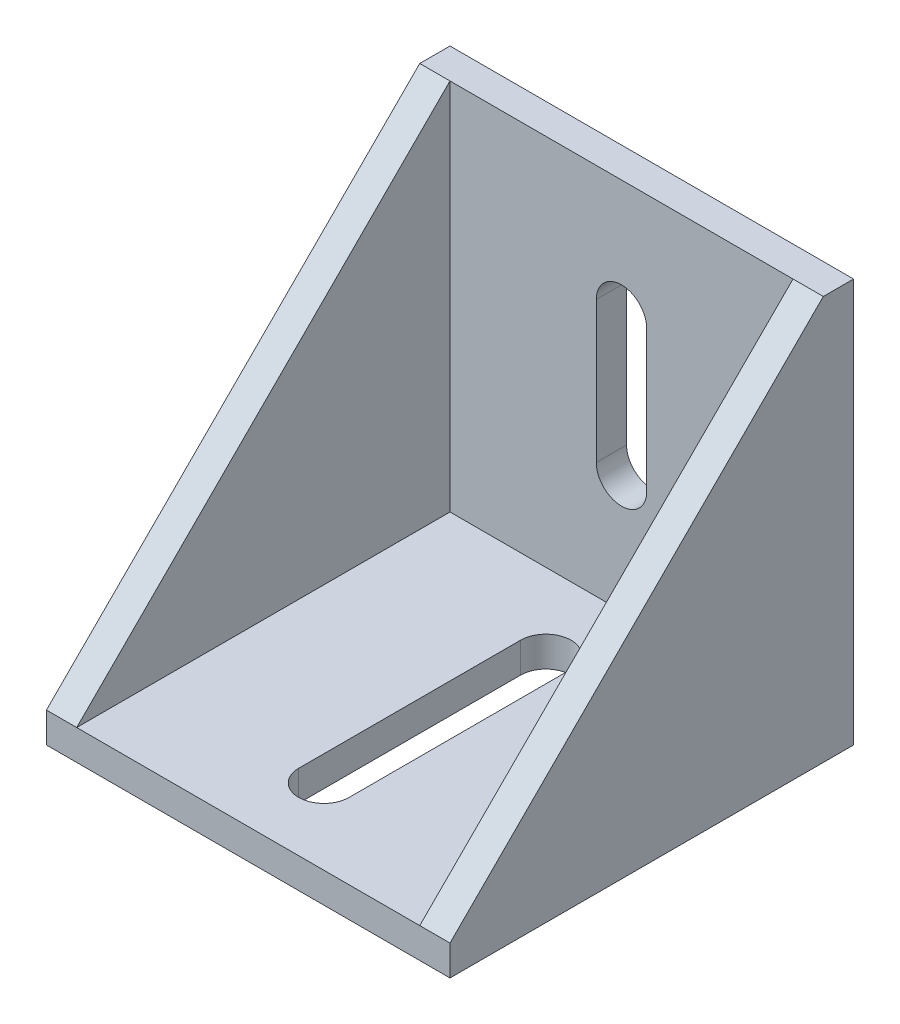
ISO-10303-21;
HEADER;
FILE_DESCRIPTION(('STEP AP214'),'2;1');
FILE_NAME('part.step','',(''),(''),'','','');
FILE_SCHEMA(('AUTOMOTIVE_DESIGN { 1 0 10303 214 1 1 1 1 }'));
ENDSEC;
DATA;
#1=APPLICATION_CONTEXT('core data for automotive mechanical design processes');
#2=APPLICATION_PROTOCOL_DEFINITION('international standard','automotive_design',2000,#1);
#3=PRODUCT_CONTEXT('',#1,'mechanical');
#4=PRODUCT('Part','Part','',(#3));
#5=PRODUCT_RELATED_PRODUCT_CATEGORY('part','',(#4));
#6=PRODUCT_DEFINITION_FORMATION('','',#4);
#7=PRODUCT_DEFINITION_CONTEXT('part definition',#1,'design');
#8=PRODUCT_DEFINITION('design','',#6,#7);
#9=PRODUCT_DEFINITION_SHAPE('','',#8);
#10=(LENGTH_UNIT() NAMED_UNIT(*) SI_UNIT(.MILLI.,.METRE.));
#11=(NAMED_UNIT(*) PLANE_ANGLE_UNIT() SI_UNIT($,.RADIAN.));
#12=(NAMED_UNIT(*) SI_UNIT($,.STERADIAN.) SOLID_ANGLE_UNIT());
#13=UNCERTAINTY_MEASURE_WITH_UNIT(LENGTH_MEASURE(1.E-05),#10,'distance_accuracy_value','');
#14=(GEOMETRIC_REPRESENTATION_CONTEXT(3) GLOBAL_UNCERTAINTY_ASSIGNED_CONTEXT((#13)) GLOBAL_UNIT_ASSIGNED_CONTEXT((#10,
#11,#12)) REPRESENTATION_CONTEXT('',''));
#15=CARTESIAN_POINT('',(0.,0.,0.));
#16=DIRECTION('',(0.,0.,1.));
#17=DIRECTION('',(1.,0.,0.));
#18=AXIS2_PLACEMENT_3D('',#15,#16,#17);
#19=CARTESIAN_POINT('',(0.,3.,40.));
#20=DIRECTION('',(1.,0.,0.));
#21=DIRECTION('',(0.,0.,-1.));
#22=AXIS2_PLACEMENT_3D('',#19,#20,#21);
#23=PLANE('',#22);
#24=DIRECTION('',(0.,-1.,0.));
#25=VECTOR('',#24,1.);
#26=CARTESIAN_POINT('',(0.,3.,40.));
#27=LINE('',#26,#25);
#28=CARTESIAN_POINT('',(0.,3.,40.));
#29=VERTEX_POINT('',#28);
#30=CARTESIAN_POINT('',(0.,0.,40.));
#31=VERTEX_POINT('',#30);
#32=EDGE_CURVE('E11',#29,#31,#27,.T.);
#33=ORIENTED_EDGE('',*,*,#32,.F.);
#34=DIRECTION('',(0.,0.707106781186548,-0.707106781186548));
#35=VECTOR('',#34,1.);
#36=CARTESIAN_POINT('',(0.,40.,3.));
#37=LINE('',#36,#35);
#38=CARTESIAN_POINT('',(0.,40.,3.));
#39=VERTEX_POINT('',#38);
#40=EDGE_CURVE('E229',#29,#39,#37,.T.);
#41=ORIENTED_EDGE('',*,*,#40,.T.);
#42=DIRECTION('',(0.,0.,-1.));
#43=VECTOR('',#42,1.);
#44=CARTESIAN_POINT('',(0.,40.,3.));
#45=LINE('',#44,#43);
#46=CARTESIAN_POINT('',(0.,40.,0.));
#47=VERTEX_POINT('',#46);
#48=EDGE_CURVE('E246',#39,#47,#45,.T.);
#49=ORIENTED_EDGE('',*,*,#48,.T.);
#50=DIRECTION('',(0.,-1.,0.));
#51=VECTOR('',#50,1.);
#52=CARTESIAN_POINT('',(0.,3.,0.));
#53=LINE('',#52,#51);
#54=CARTESIAN_POINT('',(0.,0.,0.));
#55=VERTEX_POINT('',#54);
#56=EDGE_CURVE('E258',#47,#55,#53,.T.);
#57=ORIENTED_EDGE('',*,*,#56,.T.);
#58=DIRECTION('',(0.,0.,1.));
#59=VECTOR('',#58,1.);
#60=CARTESIAN_POINT('',(0.,0.,40.));
#61=LINE('',#60,#59);
#62=EDGE_CURVE('E253',#55,#31,#61,.T.);
#63=ORIENTED_EDGE('',*,*,#62,.T.);
#64=EDGE_LOOP('',(#33,#41,#49,#57,#63));
#65=FACE_BOUND('',#64,.T.);
#66=ADVANCED_FACE('F33',(#65),#23,.F.);
#67=CARTESIAN_POINT('',(40.,3.,40.));
#68=DIRECTION('',(0.,0.,-1.));
#69=DIRECTION('',(-1.,0.,0.));
#70=AXIS2_PLACEMENT_3D('',#67,#68,#69);
#71=PLANE('',#70);
#72=DIRECTION('',(1.,0.,0.));
#73=VECTOR('',#72,1.);
#74=CARTESIAN_POINT('',(40.,0.,40.));
#75=LINE('',#74,#73);
#76=CARTESIAN_POINT('',(40.,0.,40.));
#77=VERTEX_POINT('',#76);
#78=EDGE_CURVE('E262',#31,#77,#75,.T.);
#79=ORIENTED_EDGE('',*,*,#78,.T.);
#80=DIRECTION('',(0.,-1.,0.));
#81=VECTOR('',#80,1.);
#82=CARTESIAN_POINT('',(40.,3.,40.));
#83=LINE('',#82,#81);
#84=CARTESIAN_POINT('',(40.,3.,40.));
#85=VERTEX_POINT('',#84);
#86=EDGE_CURVE('E42',#85,#77,#83,.T.);
#87=ORIENTED_EDGE('',*,*,#86,.F.);
#88=DIRECTION('',(1.,0.,0.));
#89=VECTOR('',#88,1.);
#90=CARTESIAN_POINT('',(37.,3.,40.));
#91=LINE('',#90,#89);
#92=CARTESIAN_POINT('',(37.,3.,40.));
#93=VERTEX_POINT('',#92);
#94=EDGE_CURVE('E227',#93,#85,#91,.T.);
#95=ORIENTED_EDGE('',*,*,#94,.F.);
#96=DIRECTION('',(1.,0.,0.));
#97=VECTOR('',#96,1.);
#98=CARTESIAN_POINT('',(40.,3.,40.));
#99=LINE('',#98,#97);
#100=CARTESIAN_POINT('',(3.,3.,40.));
#101=VERTEX_POINT('',#100);
#102=EDGE_CURVE('E259',#101,#93,#99,.T.);
#103=ORIENTED_EDGE('',*,*,#102,.F.);
#104=EDGE_CURVE('E256',#29,#101,#99,.T.);
#105=ORIENTED_EDGE('',*,*,#104,.F.);
#106=ORIENTED_EDGE('',*,*,#32,.T.);
#107=EDGE_LOOP('',(#79,#87,#95,#103,#105,#106));
#108=FACE_BOUND('',#107,.T.);
#109=ADVANCED_FACE('F315',(#108),#71,.F.);
#110=CARTESIAN_POINT('',(40.,3.,0.));
#111=DIRECTION('',(-1.,0.,0.));
#112=DIRECTION('',(0.,0.,1.));
#113=AXIS2_PLACEMENT_3D('',#110,#111,#112);
#114=PLANE('',#113);
#115=DIRECTION('',(0.,0.,-1.));
#116=VECTOR('',#115,1.);
#117=CARTESIAN_POINT('',(40.,0.,0.));
#118=LINE('',#117,#116);
#119=CARTESIAN_POINT('',(40.,0.,0.));
#120=VERTEX_POINT('',#119);
#121=EDGE_CURVE('E264',#77,#120,#118,.T.);
#122=ORIENTED_EDGE('',*,*,#121,.T.);
#123=DIRECTION('',(0.,-1.,0.));
#124=VECTOR('',#123,1.);
#125=CARTESIAN_POINT('',(40.,3.,0.));
#126=LINE('',#125,#124);
#127=CARTESIAN_POINT('',(40.,40.,0.));
#128=VERTEX_POINT('',#127);
#129=EDGE_CURVE('E270',#128,#120,#126,.T.);
#130=ORIENTED_EDGE('',*,*,#129,.F.);
#131=DIRECTION('',(0.,0.,-1.));
#132=VECTOR('',#131,1.);
#133=CARTESIAN_POINT('',(40.,40.,3.));
#134=LINE('',#133,#132);
#135=CARTESIAN_POINT('',(40.,40.,3.));
#136=VERTEX_POINT('',#135);
#137=EDGE_CURVE('E250',#136,#128,#134,.T.);
#138=ORIENTED_EDGE('',*,*,#137,.F.);
#139=DIRECTION('',(0.,-0.707106781186548,0.707106781186548));
#140=VECTOR('',#139,1.);
#141=CARTESIAN_POINT('',(40.,40.,3.));
#142=LINE('',#141,#140);
#143=EDGE_CURVE('E209',#136,#85,#142,.T.);
#144=ORIENTED_EDGE('',*,*,#143,.T.);
#145=ORIENTED_EDGE('',*,*,#86,.T.);
#146=EDGE_LOOP('',(#122,#130,#138,#144,#145));
#147=FACE_BOUND('',#146,.T.);
#148=ADVANCED_FACE('F277',(#147),#114,.F.);
#149=CARTESIAN_POINT('',(0.,3.,0.));
#150=DIRECTION('',(0.,0.,1.));
#151=DIRECTION('',(1.,0.,0.));
#152=AXIS2_PLACEMENT_3D('',#149,#150,#151);
#153=PLANE('',#152);
#154=DIRECTION('',(0.,-1.,0.));
#155=VECTOR('',#154,1.);
#156=CARTESIAN_POINT('',(17.5,14.5,0.));
#157=LINE('',#156,#155);
#158=CARTESIAN_POINT('',(17.5,28.5,0.));
#159=VERTEX_POINT('',#158);
#160=CARTESIAN_POINT('',(17.5,14.5,0.));
#161=VERTEX_POINT('',#160);
#162=EDGE_CURVE('E194',#159,#161,#157,.T.);
#163=ORIENTED_EDGE('',*,*,#162,.T.);
#164=CARTESIAN_POINT('',(20.,14.5,0.));
#165=DIRECTION('',(0.,0.,1.));
#166=DIRECTION('',(1.,0.,0.));
#167=AXIS2_PLACEMENT_3D('',#164,#165,#166);
#168=CIRCLE('',#167,2.5);
#169=CARTESIAN_POINT('',(22.5,14.5,0.));
#170=VERTEX_POINT('',#169);
#171=EDGE_CURVE('E184',#161,#170,#168,.T.);
#172=ORIENTED_EDGE('',*,*,#171,.T.);
#173=DIRECTION('',(0.,1.,0.));
#174=VECTOR('',#173,1.);
#175=CARTESIAN_POINT('',(22.5,14.5,0.));
#176=LINE('',#175,#174);
#177=CARTESIAN_POINT('',(22.5,28.5,0.));
#178=VERTEX_POINT('',#177);
#179=EDGE_CURVE('E187',#170,#178,#176,.T.);
#180=ORIENTED_EDGE('',*,*,#179,.T.);
#181=CARTESIAN_POINT('',(20.,28.5,0.));
#182=DIRECTION('',(0.,0.,1.));
#183=DIRECTION('',(1.,0.,0.));
#184=AXIS2_PLACEMENT_3D('',#181,#182,#183);
#185=CIRCLE('',#184,2.5);
#186=EDGE_CURVE('E191',#178,#159,#185,.T.);
#187=ORIENTED_EDGE('',*,*,#186,.T.);
#188=EDGE_LOOP('',(#163,#172,#180,#187));
#189=FACE_BOUND('',#188,.T.);
#190=DIRECTION('',(-1.,0.,0.));
#191=VECTOR('',#190,1.);
#192=CARTESIAN_POINT('',(0.,0.,0.));
#193=LINE('',#192,#191);
#194=EDGE_CURVE('E266',#120,#55,#193,.T.);
#195=ORIENTED_EDGE('',*,*,#194,.T.);
#196=ORIENTED_EDGE('',*,*,#56,.F.);
#197=DIRECTION('',(1.,0.,0.));
#198=VECTOR('',#197,1.);
#199=CARTESIAN_POINT('',(40.,40.,0.));
#200=LINE('',#199,#198);
#201=EDGE_CURVE('E240',#47,#128,#200,.T.);
#202=ORIENTED_EDGE('',*,*,#201,.T.);
#203=ORIENTED_EDGE('',*,*,#129,.T.);
#204=EDGE_LOOP('',(#195,#196,#202,#203));
#205=FACE_BOUND('',#204,.T.);
#206=ADVANCED_FACE('F284',(#189,#205),#153,.F.);
#207=CARTESIAN_POINT('',(0.,3.,0.));
#208=DIRECTION('',(0.,-1.,0.));
#209=DIRECTION('',(0.,0.,-1.));
#210=AXIS2_PLACEMENT_3D('',#207,#208,#209);
#211=PLANE('',#210);
#212=DIRECTION('',(0.,0.,-1.));
#213=VECTOR('',#212,1.);
#214=CARTESIAN_POINT('',(22.5,3.,32.5));
#215=LINE('',#214,#213);
#216=CARTESIAN_POINT('',(22.5,3.,32.5));
#217=VERTEX_POINT('',#216);
#218=CARTESIAN_POINT('',(22.5,3.,10.5));
#219=VERTEX_POINT('',#218);
#220=EDGE_CURVE('E174',#217,#219,#215,.T.);
#221=ORIENTED_EDGE('',*,*,#220,.F.);
#222=CARTESIAN_POINT('',(20.,3.,32.5));
#223=DIRECTION('',(0.,1.,0.));
#224=DIRECTION('',(0.,0.,1.));
#225=AXIS2_PLACEMENT_3D('',#222,#223,#224);
#226=CIRCLE('',#225,2.50000000000001);
#227=CARTESIAN_POINT('',(17.5,3.,32.5));
#228=VERTEX_POINT('',#227);
#229=EDGE_CURVE('E49',#228,#217,#226,.T.);
#230=ORIENTED_EDGE('',*,*,#229,.F.);
#231=DIRECTION('',(0.,0.,1.));
#232=VECTOR('',#231,1.);
#233=CARTESIAN_POINT('',(17.5,3.,32.5));
#234=LINE('',#233,#232);
#235=CARTESIAN_POINT('',(17.5,3.,10.5));
#236=VERTEX_POINT('',#235);
#237=EDGE_CURVE('E165',#236,#228,#234,.T.);
#238=ORIENTED_EDGE('',*,*,#237,.F.);
#239=CARTESIAN_POINT('',(20.,3.,10.5));
#240=DIRECTION('',(0.,1.,0.));
#241=DIRECTION('',(0.,0.,1.));
#242=AXIS2_PLACEMENT_3D('',#239,#240,#241);
#243=CIRCLE('',#242,2.50000000000001);
#244=EDGE_CURVE('E168',#219,#236,#243,.T.);
#245=ORIENTED_EDGE('',*,*,#244,.F.);
#246=EDGE_LOOP('',(#221,#230,#238,#245));
#247=FACE_BOUND('',#246,.T.);
#248=ORIENTED_EDGE('',*,*,#102,.T.);
#249=DIRECTION('',(0.,0.,-1.));
#250=VECTOR('',#249,1.);
#251=CARTESIAN_POINT('',(37.,3.,40.));
#252=LINE('',#251,#250);
#253=CARTESIAN_POINT('',(37.,3.,2.99999999999999));
#254=VERTEX_POINT('',#253);
#255=EDGE_CURVE('E221',#93,#254,#252,.T.);
#256=ORIENTED_EDGE('',*,*,#255,.T.);
#257=DIRECTION('',(-1.,0.,0.));
#258=VECTOR('',#257,1.);
#259=CARTESIAN_POINT('',(0.,3.,3.));
#260=LINE('',#259,#258);
#261=CARTESIAN_POINT('',(3.,3.,3.));
#262=VERTEX_POINT('',#261);
#263=EDGE_CURVE('E36',#254,#262,#260,.T.);
#264=ORIENTED_EDGE('',*,*,#263,.T.);
#265=DIRECTION('',(0.,0.,1.));
#266=VECTOR('',#265,1.);
#267=CARTESIAN_POINT('',(3.,3.,3.));
#268=LINE('',#267,#266);
#269=EDGE_CURVE('E232',#262,#101,#268,.T.);
#270=ORIENTED_EDGE('',*,*,#269,.T.);
#271=EDGE_LOOP('',(#248,#256,#264,#270));
#272=FACE_BOUND('',#271,.T.);
#273=ADVANCED_FACE('F307',(#247,#272),#211,.F.);
#274=CARTESIAN_POINT('',(0.,0.,0.));
#275=DIRECTION('',(0.,-1.,0.));
#276=DIRECTION('',(0.,0.,-1.));
#277=AXIS2_PLACEMENT_3D('',#274,#275,#276);
#278=PLANE('',#277);
#279=CARTESIAN_POINT('',(20.,0.,32.5));
#280=DIRECTION('',(0.,1.,0.));
#281=DIRECTION('',(0.,0.,1.));
#282=AXIS2_PLACEMENT_3D('',#279,#280,#281);
#283=CIRCLE('',#282,2.50000000000001);
#284=CARTESIAN_POINT('',(17.5,0.,32.5));
#285=VERTEX_POINT('',#284);
#286=CARTESIAN_POINT('',(22.5,0.,32.5));
#287=VERTEX_POINT('',#286);
#288=EDGE_CURVE('E149',#285,#287,#283,.T.);
#289=ORIENTED_EDGE('',*,*,#288,.T.);
#290=DIRECTION('',(0.,0.,-1.));
#291=VECTOR('',#290,1.);
#292=CARTESIAN_POINT('',(22.5,0.,32.5));
#293=LINE('',#292,#291);
#294=CARTESIAN_POINT('',(22.5,0.,10.5));
#295=VERTEX_POINT('',#294);
#296=EDGE_CURVE('E158',#287,#295,#293,.T.);
#297=ORIENTED_EDGE('',*,*,#296,.T.);
#298=CARTESIAN_POINT('',(20.,0.,10.5));
#299=DIRECTION('',(0.,1.,0.));
#300=DIRECTION('',(0.,0.,1.));
#301=AXIS2_PLACEMENT_3D('',#298,#299,#300);
#302=CIRCLE('',#301,2.50000000000001);
#303=CARTESIAN_POINT('',(17.5,0.,10.5));
#304=VERTEX_POINT('',#303);
#305=EDGE_CURVE('E57',#295,#304,#302,.T.);
#306=ORIENTED_EDGE('',*,*,#305,.T.);
#307=DIRECTION('',(0.,0.,1.));
#308=VECTOR('',#307,1.);
#309=CARTESIAN_POINT('',(17.5,0.,32.5));
#310=LINE('',#309,#308);
#311=EDGE_CURVE('E155',#304,#285,#310,.T.);
#312=ORIENTED_EDGE('',*,*,#311,.T.);
#313=EDGE_LOOP('',(#289,#297,#306,#312));
#314=FACE_BOUND('',#313,.T.);
#315=ORIENTED_EDGE('',*,*,#62,.F.);
#316=ORIENTED_EDGE('',*,*,#194,.F.);
#317=ORIENTED_EDGE('',*,*,#121,.F.);
#318=ORIENTED_EDGE('',*,*,#78,.F.);
#319=EDGE_LOOP('',(#315,#316,#317,#318));
#320=FACE_BOUND('',#319,.T.);
#321=ADVANCED_FACE('F162',(#314,#320),#278,.T.);
#322=CARTESIAN_POINT('',(40.,40.,3.));
#323=DIRECTION('',(0.,1.,0.));
#324=DIRECTION('',(0.,0.,1.));
#325=AXIS2_PLACEMENT_3D('',#322,#323,#324);
#326=PLANE('',#325);
#327=ORIENTED_EDGE('',*,*,#201,.F.);
#328=ORIENTED_EDGE('',*,*,#48,.F.);
#329=DIRECTION('',(1.,0.,0.));
#330=VECTOR('',#329,1.);
#331=CARTESIAN_POINT('',(40.,40.,3.));
#332=LINE('',#331,#330);
#333=CARTESIAN_POINT('',(3.,40.,3.));
#334=VERTEX_POINT('',#333);
#335=EDGE_CURVE('E243',#39,#334,#332,.T.);
#336=ORIENTED_EDGE('',*,*,#335,.T.);
#337=CARTESIAN_POINT('',(37.,40.,3.));
#338=VERTEX_POINT('',#337);
#339=EDGE_CURVE('E247',#334,#338,#332,.T.);
#340=ORIENTED_EDGE('',*,*,#339,.T.);
#341=DIRECTION('',(1.,0.,0.));
#342=VECTOR('',#341,1.);
#343=CARTESIAN_POINT('',(37.,40.,3.));
#344=LINE('',#343,#342);
#345=EDGE_CURVE('E224',#338,#136,#344,.T.);
#346=ORIENTED_EDGE('',*,*,#345,.T.);
#347=ORIENTED_EDGE('',*,*,#137,.T.);
#348=EDGE_LOOP('',(#327,#328,#336,#340,#346,#347));
#349=FACE_BOUND('',#348,.T.);
#350=ADVANCED_FACE('F291',(#349),#326,.T.);
#351=CARTESIAN_POINT('',(0.,0.,3.));
#352=DIRECTION('',(0.,0.,1.));
#353=DIRECTION('',(1.,0.,0.));
#354=AXIS2_PLACEMENT_3D('',#351,#352,#353);
#355=PLANE('',#354);
#356=CARTESIAN_POINT('',(20.,14.5,3.));
#357=DIRECTION('',(0.,0.,1.));
#358=DIRECTION('',(1.,0.,0.));
#359=AXIS2_PLACEMENT_3D('',#356,#357,#358);
#360=CIRCLE('',#359,2.5);
#361=CARTESIAN_POINT('',(17.5,14.5,3.));
#362=VERTEX_POINT('',#361);
#363=CARTESIAN_POINT('',(22.5,14.5,3.));
#364=VERTEX_POINT('',#363);
#365=EDGE_CURVE('E180',#362,#364,#360,.T.);
#366=ORIENTED_EDGE('',*,*,#365,.F.);
#367=DIRECTION('',(0.,-1.,0.));
#368=VECTOR('',#367,1.);
#369=CARTESIAN_POINT('',(17.5,14.5,3.));
#370=LINE('',#369,#368);
#371=CARTESIAN_POINT('',(17.5,28.5,3.));
#372=VERTEX_POINT('',#371);
#373=EDGE_CURVE('E188',#372,#362,#370,.T.);
#374=ORIENTED_EDGE('',*,*,#373,.F.);
#375=CARTESIAN_POINT('',(20.,28.5,3.));
#376=DIRECTION('',(0.,0.,1.));
#377=DIRECTION('',(1.,0.,0.));
#378=AXIS2_PLACEMENT_3D('',#375,#376,#377);
#379=CIRCLE('',#378,2.5);
#380=CARTESIAN_POINT('',(22.5,28.5,3.));
#381=VERTEX_POINT('',#380);
#382=EDGE_CURVE('E202',#381,#372,#379,.T.);
#383=ORIENTED_EDGE('',*,*,#382,.F.);
#384=DIRECTION('',(0.,1.,0.));
#385=VECTOR('',#384,1.);
#386=CARTESIAN_POINT('',(22.5,14.5,3.));
#387=LINE('',#386,#385);
#388=EDGE_CURVE('E199',#364,#381,#387,.T.);
#389=ORIENTED_EDGE('',*,*,#388,.F.);
#390=EDGE_LOOP('',(#366,#374,#383,#389));
#391=FACE_BOUND('',#390,.T.);
#392=DIRECTION('',(0.,1.,0.));
#393=VECTOR('',#392,1.);
#394=CARTESIAN_POINT('',(37.,3.,2.99999999999999));
#395=LINE('',#394,#393);
#396=EDGE_CURVE('E216',#254,#338,#395,.T.);
#397=ORIENTED_EDGE('',*,*,#396,.T.);
#398=ORIENTED_EDGE('',*,*,#339,.F.);
#399=DIRECTION('',(0.,-1.,0.));
#400=VECTOR('',#399,1.);
#401=CARTESIAN_POINT('',(3.,40.,3.));
#402=LINE('',#401,#400);
#403=EDGE_CURVE('E237',#334,#262,#402,.T.);
#404=ORIENTED_EDGE('',*,*,#403,.T.);
#405=ORIENTED_EDGE('',*,*,#263,.F.);
#406=EDGE_LOOP('',(#397,#398,#404,#405));
#407=FACE_BOUND('',#406,.T.);
#408=ADVANCED_FACE('F302',(#391,#407),#355,.T.);
#409=CARTESIAN_POINT('',(3.,40.,3.));
#410=DIRECTION('',(0.,0.707106781186547,0.707106781186547));
#411=DIRECTION('',(0.,-0.707106781186548,0.707106781186548));
#412=AXIS2_PLACEMENT_3D('',#409,#410,#411);
#413=PLANE('',#412);
#414=ORIENTED_EDGE('',*,*,#40,.F.);
#415=ORIENTED_EDGE('',*,*,#104,.T.);
#416=DIRECTION('',(0.,0.707106781186548,-0.707106781186548));
#417=VECTOR('',#416,1.);
#418=CARTESIAN_POINT('',(3.,40.,3.));
#419=LINE('',#418,#417);
#420=EDGE_CURVE('E235',#101,#334,#419,.T.);
#421=ORIENTED_EDGE('',*,*,#420,.T.);
#422=ORIENTED_EDGE('',*,*,#335,.F.);
#423=EDGE_LOOP('',(#414,#415,#421,#422));
#424=FACE_BOUND('',#423,.T.);
#425=ADVANCED_FACE('F313',(#424),#413,.T.);
#426=CARTESIAN_POINT('',(3.,0.,0.));
#427=DIRECTION('',(1.,0.,0.));
#428=DIRECTION('',(0.,0.,-1.));
#429=AXIS2_PLACEMENT_3D('',#426,#427,#428);
#430=PLANE('',#429);
#431=ORIENTED_EDGE('',*,*,#269,.F.);
#432=ORIENTED_EDGE('',*,*,#403,.F.);
#433=ORIENTED_EDGE('',*,*,#420,.F.);
#434=EDGE_LOOP('',(#431,#432,#433));
#435=FACE_BOUND('',#434,.T.);
#436=ADVANCED_FACE('F311',(#435),#430,.T.);
#437=CARTESIAN_POINT('',(37.,40.,3.));
#438=DIRECTION('',(0.,0.707106781186547,0.707106781186547));
#439=DIRECTION('',(0.,-0.707106781186548,0.707106781186548));
#440=AXIS2_PLACEMENT_3D('',#437,#438,#439);
#441=PLANE('',#440);
#442=ORIENTED_EDGE('',*,*,#143,.F.);
#443=ORIENTED_EDGE('',*,*,#345,.F.);
#444=DIRECTION('',(0.,-0.707106781186548,0.707106781186548));
#445=VECTOR('',#444,1.);
#446=CARTESIAN_POINT('',(37.,40.,3.));
#447=LINE('',#446,#445);
#448=EDGE_CURVE('E219',#338,#93,#447,.T.);
#449=ORIENTED_EDGE('',*,*,#448,.T.);
#450=ORIENTED_EDGE('',*,*,#94,.T.);
#451=EDGE_LOOP('',(#442,#443,#449,#450));
#452=FACE_BOUND('',#451,.T.);
#453=ADVANCED_FACE('F296',(#452),#441,.T.);
#454=CARTESIAN_POINT('',(37.,0.,0.));
#455=DIRECTION('',(-1.,0.,0.));
#456=DIRECTION('',(0.,0.,1.));
#457=AXIS2_PLACEMENT_3D('',#454,#455,#456);
#458=PLANE('',#457);
#459=ORIENTED_EDGE('',*,*,#396,.F.);
#460=ORIENTED_EDGE('',*,*,#255,.F.);
#461=ORIENTED_EDGE('',*,*,#448,.F.);
#462=EDGE_LOOP('',(#459,#460,#461));
#463=FACE_BOUND('',#462,.T.);
#464=ADVANCED_FACE('F299',(#463),#458,.T.);
#465=CARTESIAN_POINT('',(20.,14.5,0.));
#466=DIRECTION('',(0.,0.,1.));
#467=DIRECTION('',(1.,0.,0.));
#468=AXIS2_PLACEMENT_3D('',#465,#466,#467);
#469=CYLINDRICAL_SURFACE('',#468,2.5);
#470=ORIENTED_EDGE('',*,*,#365,.T.);
#471=DIRECTION('',(0.,0.,1.));
#472=VECTOR('',#471,1.);
#473=CARTESIAN_POINT('',(22.5,14.5,0.));
#474=LINE('',#473,#472);
#475=EDGE_CURVE('E197',#170,#364,#474,.T.);
#476=ORIENTED_EDGE('',*,*,#475,.F.);
#477=ORIENTED_EDGE('',*,*,#171,.F.);
#478=DIRECTION('',(0.,0.,1.));
#479=VECTOR('',#478,1.);
#480=CARTESIAN_POINT('',(17.5,14.5,0.));
#481=LINE('',#480,#479);
#482=EDGE_CURVE('E207',#161,#362,#481,.T.);
#483=ORIENTED_EDGE('',*,*,#482,.T.);
#484=EDGE_LOOP('',(#470,#476,#477,#483));
#485=FACE_BOUND('',#484,.T.);
#486=ADVANCED_FACE('F344',(#485),#469,.F.);
#487=CARTESIAN_POINT('',(17.5,14.5,0.));
#488=DIRECTION('',(-1.,0.,0.));
#489=DIRECTION('',(0.,-1.,0.));
#490=AXIS2_PLACEMENT_3D('',#487,#488,#489);
#491=PLANE('',#490);
#492=ORIENTED_EDGE('',*,*,#373,.T.);
#493=ORIENTED_EDGE('',*,*,#482,.F.);
#494=ORIENTED_EDGE('',*,*,#162,.F.);
#495=DIRECTION('',(0.,0.,1.));
#496=VECTOR('',#495,1.);
#497=CARTESIAN_POINT('',(17.5,28.5,0.));
#498=LINE('',#497,#496);
#499=EDGE_CURVE('E210',#159,#372,#498,.T.);
#500=ORIENTED_EDGE('',*,*,#499,.T.);
#501=EDGE_LOOP('',(#492,#493,#494,#500));
#502=FACE_BOUND('',#501,.T.);
#503=ADVANCED_FACE('F347',(#502),#491,.F.);
#504=CARTESIAN_POINT('',(20.,28.5,0.));
#505=DIRECTION('',(0.,0.,1.));
#506=DIRECTION('',(1.,0.,0.));
#507=AXIS2_PLACEMENT_3D('',#504,#505,#506);
#508=CYLINDRICAL_SURFACE('',#507,2.5);
#509=ORIENTED_EDGE('',*,*,#382,.T.);
#510=ORIENTED_EDGE('',*,*,#499,.F.);
#511=ORIENTED_EDGE('',*,*,#186,.F.);
#512=DIRECTION('',(0.,0.,1.));
#513=VECTOR('',#512,1.);
#514=CARTESIAN_POINT('',(22.5,28.5,0.));
#515=LINE('',#514,#513);
#516=EDGE_CURVE('E212',#178,#381,#515,.T.);
#517=ORIENTED_EDGE('',*,*,#516,.T.);
#518=EDGE_LOOP('',(#509,#510,#511,#517));
#519=FACE_BOUND('',#518,.T.);
#520=ADVANCED_FACE('F352',(#519),#508,.F.);
#521=CARTESIAN_POINT('',(22.5,14.5,0.));
#522=DIRECTION('',(1.,0.,0.));
#523=DIRECTION('',(0.,1.,0.));
#524=AXIS2_PLACEMENT_3D('',#521,#522,#523);
#525=PLANE('',#524);
#526=ORIENTED_EDGE('',*,*,#388,.T.);
#527=ORIENTED_EDGE('',*,*,#516,.F.);
#528=ORIENTED_EDGE('',*,*,#179,.F.);
#529=ORIENTED_EDGE('',*,*,#475,.T.);
#530=EDGE_LOOP('',(#526,#527,#528,#529));
#531=FACE_BOUND('',#530,.T.);
#532=ADVANCED_FACE('F349',(#531),#525,.F.);
#533=CARTESIAN_POINT('',(20.,0.,32.5));
#534=DIRECTION('',(0.,1.,0.));
#535=DIRECTION('',(0.,0.,1.));
#536=AXIS2_PLACEMENT_3D('',#533,#534,#535);
#537=CYLINDRICAL_SURFACE('',#536,2.50000000000001);
#538=ORIENTED_EDGE('',*,*,#229,.T.);
#539=DIRECTION('',(0.,1.,0.));
#540=VECTOR('',#539,1.);
#541=CARTESIAN_POINT('',(22.5,0.,32.5));
#542=LINE('',#541,#540);
#543=EDGE_CURVE('E145',#287,#217,#542,.T.);
#544=ORIENTED_EDGE('',*,*,#543,.F.);
#545=ORIENTED_EDGE('',*,*,#288,.F.);
#546=DIRECTION('',(0.,1.,0.));
#547=VECTOR('',#546,1.);
#548=CARTESIAN_POINT('',(17.5,0.,32.5));
#549=LINE('',#548,#547);
#550=EDGE_CURVE('E178',#285,#228,#549,.T.);
#551=ORIENTED_EDGE('',*,*,#550,.T.);
#552=EDGE_LOOP('',(#538,#544,#545,#551));
#553=FACE_BOUND('',#552,.T.);
#554=ADVANCED_FACE('F147',(#553),#537,.F.);
#555=CARTESIAN_POINT('',(17.5,0.,32.5));
#556=DIRECTION('',(-1.,0.,0.));
#557=DIRECTION('',(0.,0.,1.));
#558=AXIS2_PLACEMENT_3D('',#555,#556,#557);
#559=PLANE('',#558);
#560=ORIENTED_EDGE('',*,*,#237,.T.);
#561=ORIENTED_EDGE('',*,*,#550,.F.);
#562=ORIENTED_EDGE('',*,*,#311,.F.);
#563=DIRECTION('',(0.,1.,0.));
#564=VECTOR('',#563,1.);
#565=CARTESIAN_POINT('',(17.5,0.,10.5));
#566=LINE('',#565,#564);
#567=EDGE_CURVE('E181',#304,#236,#566,.T.);
#568=ORIENTED_EDGE('',*,*,#567,.T.);
#569=EDGE_LOOP('',(#560,#561,#562,#568));
#570=FACE_BOUND('',#569,.T.);
#571=ADVANCED_FACE('F362',(#570),#559,.F.);
#572=CARTESIAN_POINT('',(20.,0.,10.5));
#573=DIRECTION('',(0.,1.,0.));
#574=DIRECTION('',(0.,0.,1.));
#575=AXIS2_PLACEMENT_3D('',#572,#573,#574);
#576=CYLINDRICAL_SURFACE('',#575,2.50000000000001);
#577=ORIENTED_EDGE('',*,*,#244,.T.);
#578=ORIENTED_EDGE('',*,*,#567,.F.);
#579=ORIENTED_EDGE('',*,*,#305,.F.);
#580=DIRECTION('',(0.,1.,0.));
#581=VECTOR('',#580,1.);
#582=CARTESIAN_POINT('',(22.5,0.,10.5));
#583=LINE('',#582,#581);
#584=EDGE_CURVE('E154',#295,#219,#583,.T.);
#585=ORIENTED_EDGE('',*,*,#584,.T.);
#586=EDGE_LOOP('',(#577,#578,#579,#585));
#587=FACE_BOUND('',#586,.T.);
#588=ADVANCED_FACE('F365',(#587),#576,.F.);
#589=CARTESIAN_POINT('',(22.5,0.,32.5));
#590=DIRECTION('',(1.,0.,0.));
#591=DIRECTION('',(0.,0.,-1.));
#592=AXIS2_PLACEMENT_3D('',#589,#590,#591);
#593=PLANE('',#592);
#594=ORIENTED_EDGE('',*,*,#220,.T.);
#595=ORIENTED_EDGE('',*,*,#584,.F.);
#596=ORIENTED_EDGE('',*,*,#296,.F.);
#597=ORIENTED_EDGE('',*,*,#543,.T.);
#598=EDGE_LOOP('',(#594,#595,#596,#597));
#599=FACE_BOUND('',#598,.T.);
#600=ADVANCED_FACE('F159',(#599),#593,.F.);
#601=CLOSED_SHELL('',(#66,#109,#148,#206,#273,#321,#350,#408,#425,#436,#453,#464,#486,#503,#520,
#532,#554,#571,#588,#600));
#602=MANIFOLD_SOLID_BREP('B2',#601);
#603=ADVANCED_BREP_SHAPE_REPRESENTATION('',(#18,#602),#14);
#604=SHAPE_DEFINITION_REPRESENTATION(#9,#603);
ENDSEC;
END-ISO-10303-21;
